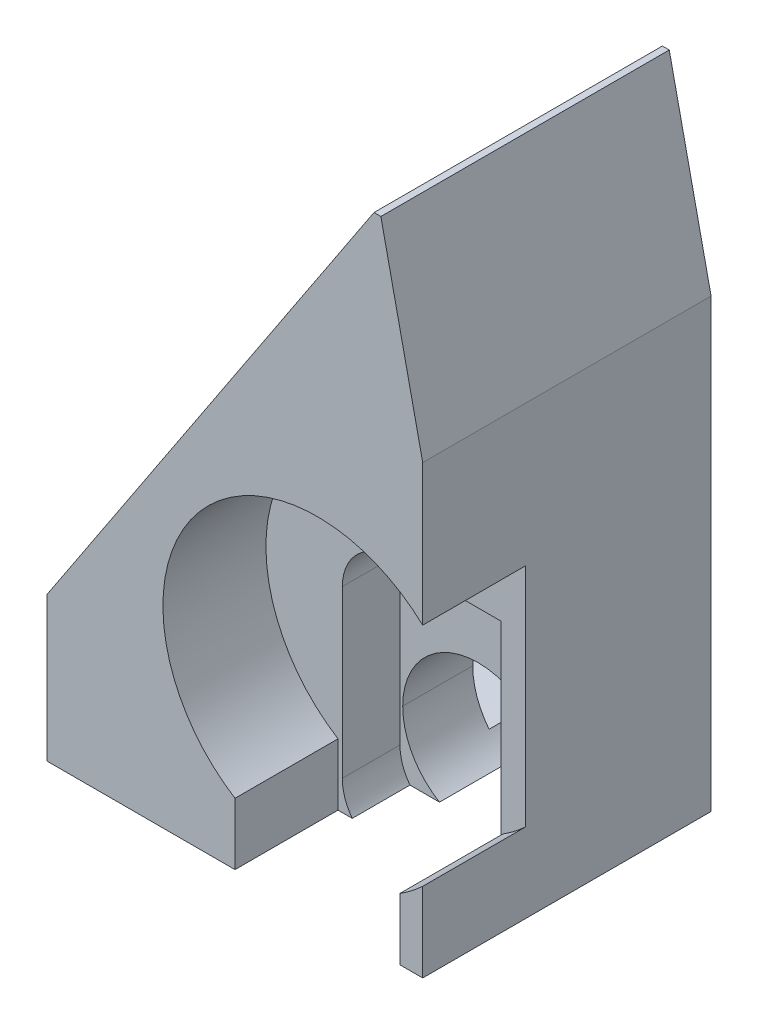
ISO-10303-21;
HEADER;
FILE_DESCRIPTION(('STEP AP214'),'2;1');
FILE_NAME('part.step','',(''),(''),'','','');
FILE_SCHEMA(('AUTOMOTIVE_DESIGN { 1 0 10303 214 1 1 1 1 }'));
ENDSEC;
DATA;
#1=APPLICATION_CONTEXT('core data for automotive mechanical design processes');
#2=APPLICATION_PROTOCOL_DEFINITION('international standard','automotive_design',2000,#1);
#3=PRODUCT_CONTEXT('',#1,'mechanical');
#4=PRODUCT('Part','Part','',(#3));
#5=PRODUCT_RELATED_PRODUCT_CATEGORY('part','',(#4));
#6=PRODUCT_DEFINITION_FORMATION('','',#4);
#7=PRODUCT_DEFINITION_CONTEXT('part definition',#1,'design');
#8=PRODUCT_DEFINITION('design','',#6,#7);
#9=PRODUCT_DEFINITION_SHAPE('','',#8);
#10=(LENGTH_UNIT() NAMED_UNIT(*) SI_UNIT(.MILLI.,.METRE.));
#11=(NAMED_UNIT(*) PLANE_ANGLE_UNIT() SI_UNIT($,.RADIAN.));
#12=(NAMED_UNIT(*) SI_UNIT($,.STERADIAN.) SOLID_ANGLE_UNIT());
#13=UNCERTAINTY_MEASURE_WITH_UNIT(LENGTH_MEASURE(1.E-05),#10,'distance_accuracy_value','');
#14=(GEOMETRIC_REPRESENTATION_CONTEXT(3) GLOBAL_UNCERTAINTY_ASSIGNED_CONTEXT((#13)) GLOBAL_UNIT_ASSIGNED_CONTEXT((#10,
#11,#12)) REPRESENTATION_CONTEXT('',''));
#15=CARTESIAN_POINT('',(0.,0.,0.));
#16=DIRECTION('',(0.,0.,1.));
#17=DIRECTION('',(1.,0.,0.));
#18=AXIS2_PLACEMENT_3D('',#15,#16,#17);
#19=CARTESIAN_POINT('',(-22.6679084803777,-59.7734336982964,0.));
#20=DIRECTION('',(0.,0.,1.));
#21=DIRECTION('',(1.,0.,0.));
#22=AXIS2_PLACEMENT_3D('',#19,#20,#21);
#23=CYLINDRICAL_SURFACE('',#22,18.3);
#24=DIRECTION('',(0.,0.,1.));
#25=VECTOR('',#24,1.);
#26=CARTESIAN_POINT('',(-4.36790848037773,-59.7734336982964,0.));
#27=LINE('',#26,#25);
#28=CARTESIAN_POINT('',(-4.36790848037773,-59.7734336982964,0.));
#29=VERTEX_POINT('',#28);
#30=CARTESIAN_POINT('',(-4.36790848037773,-59.7734336982964,31.));
#31=VERTEX_POINT('',#30);
#32=EDGE_CURVE('E366',#29,#31,#27,.T.);
#33=ORIENTED_EDGE('',*,*,#32,.F.);
#34=CARTESIAN_POINT('',(-22.6679084803777,-59.7734336982964,0.));
#35=DIRECTION('',(0.,0.,1.));
#36=DIRECTION('',(1.,0.,0.));
#37=AXIS2_PLACEMENT_3D('',#34,#35,#36);
#38=CIRCLE('',#37,18.3);
#39=CARTESIAN_POINT('',(-13.2972261280422,-75.4922222092354,0.));
#40=VERTEX_POINT('',#39);
#41=EDGE_CURVE('E440',#40,#29,#38,.T.);
#42=ORIENTED_EDGE('',*,*,#41,.F.);
#43=DIRECTION('',(0.,0.,1.));
#44=VECTOR('',#43,1.);
#45=CARTESIAN_POINT('',(-13.2972261280422,-75.4922222092354,0.));
#46=LINE('',#45,#44);
#47=CARTESIAN_POINT('',(-13.2972261280422,-75.4922222092354,31.));
#48=VERTEX_POINT('',#47);
#49=EDGE_CURVE('E432',#40,#48,#46,.T.);
#50=ORIENTED_EDGE('',*,*,#49,.T.);
#51=CARTESIAN_POINT('',(-22.6679084803777,-59.7734336982964,31.));
#52=DIRECTION('',(0.,0.,1.));
#53=DIRECTION('',(1.,0.,0.));
#54=AXIS2_PLACEMENT_3D('',#51,#52,#53);
#55=CIRCLE('',#54,18.3);
#56=EDGE_CURVE('E407',#48,#31,#55,.T.);
#57=ORIENTED_EDGE('',*,*,#56,.T.);
#58=EDGE_LOOP('',(#33,#42,#50,#57));
#59=FACE_BOUND('',#58,.T.);
#60=ADVANCED_FACE('F17',(#59),#23,.F.);
#61=CARTESIAN_POINT('',(-73.3293826692521,-40.4922222092354,10.));
#62=DIRECTION('',(0.,0.,-1.));
#63=DIRECTION('',(0.,-1.,0.));
#64=AXIS2_PLACEMENT_3D('',#61,#62,#63);
#65=PLANE('',#64);
#66=CARTESIAN_POINT('',(-73.3293826692521,-40.4922222092354,10.));
#67=DIRECTION('',(0.,0.,-1.));
#68=DIRECTION('',(-1.,0.,0.));
#69=AXIS2_PLACEMENT_3D('',#66,#67,#68);
#70=CIRCLE('',#69,1.5);
#71=CARTESIAN_POINT('',(-74.8293826692521,-40.4922222092354,10.));
#72=VERTEX_POINT('',#71);
#73=CARTESIAN_POINT('',(-71.8293826692521,-40.4922222092354,10.));
#74=VERTEX_POINT('',#73);
#75=EDGE_CURVE('E11',#72,#74,#70,.T.);
#76=ORIENTED_EDGE('',*,*,#75,.T.);
#77=CARTESIAN_POINT('',(-73.3293826692521,-40.4922222092354,10.));
#78=DIRECTION('',(0.,0.,-1.));
#79=DIRECTION('',(-1.,0.,0.));
#80=AXIS2_PLACEMENT_3D('',#77,#78,#79);
#81=CIRCLE('',#80,1.5);
#82=EDGE_CURVE('E367',#74,#72,#81,.T.);
#83=ORIENTED_EDGE('',*,*,#82,.T.);
#84=EDGE_LOOP('',(#76,#83));
#85=FACE_BOUND('',#84,.T.);
#86=ADVANCED_FACE('F726',(#85),#65,.T.);
#87=CARTESIAN_POINT('',(-73.3293826692521,-40.4922222092354,10.));
#88=DIRECTION('',(0.,0.,-1.));
#89=DIRECTION('',(-1.,0.,0.));
#90=AXIS2_PLACEMENT_3D('',#87,#88,#89);
#91=CYLINDRICAL_SURFACE('',#90,1.5);
#92=DIRECTION('',(0.,0.,-1.));
#93=VECTOR('',#92,1.);
#94=CARTESIAN_POINT('',(-71.8293826692521,-40.4922222092354,10.));
#95=LINE('',#94,#93);
#96=CARTESIAN_POINT('',(-71.8293826692521,-40.4922222092354,0.));
#97=VERTEX_POINT('',#96);
#98=EDGE_CURVE('E371',#74,#97,#95,.T.);
#99=ORIENTED_EDGE('',*,*,#98,.F.);
#100=ORIENTED_EDGE('',*,*,#75,.F.);
#101=DIRECTION('',(0.,0.,-1.));
#102=VECTOR('',#101,1.);
#103=CARTESIAN_POINT('',(-74.8293826692521,-40.4922222092354,10.));
#104=LINE('',#103,#102);
#105=CARTESIAN_POINT('',(-74.8293826692521,-40.4922222092354,0.));
#106=VERTEX_POINT('',#105);
#107=EDGE_CURVE('E391',#72,#106,#104,.T.);
#108=ORIENTED_EDGE('',*,*,#107,.T.);
#109=CARTESIAN_POINT('',(-73.3293826692521,-40.4922222092354,0.));
#110=DIRECTION('',(0.,0.,-1.));
#111=DIRECTION('',(-1.,0.,0.));
#112=AXIS2_PLACEMENT_3D('',#109,#110,#111);
#113=CIRCLE('',#112,1.5);
#114=EDGE_CURVE('E427',#106,#97,#113,.T.);
#115=ORIENTED_EDGE('',*,*,#114,.T.);
#116=EDGE_LOOP('',(#99,#100,#108,#115));
#117=FACE_BOUND('',#116,.T.);
#118=ADVANCED_FACE('F724',(#117),#91,.F.);
#119=CARTESIAN_POINT('',(-5.11790848037778,-40.4922222092355,10.));
#120=DIRECTION('',(0.,0.,-1.));
#121=DIRECTION('',(0.,-1.,0.));
#122=AXIS2_PLACEMENT_3D('',#119,#120,#121);
#123=PLANE('',#122);
#124=CARTESIAN_POINT('',(-5.11790848037778,-40.4922222092355,10.));
#125=DIRECTION('',(0.,0.,-1.));
#126=DIRECTION('',(-1.,0.,0.));
#127=AXIS2_PLACEMENT_3D('',#124,#125,#126);
#128=CIRCLE('',#127,1.5);
#129=CARTESIAN_POINT('',(-6.61790848037778,-40.4922222092355,10.));
#130=VERTEX_POINT('',#129);
#131=CARTESIAN_POINT('',(-3.61790848037779,-40.4922222092355,10.));
#132=VERTEX_POINT('',#131);
#133=EDGE_CURVE('E20',#130,#132,#128,.T.);
#134=ORIENTED_EDGE('',*,*,#133,.T.);
#135=CARTESIAN_POINT('',(-5.11790848037778,-40.4922222092355,10.));
#136=DIRECTION('',(0.,0.,-1.));
#137=DIRECTION('',(-1.,0.,0.));
#138=AXIS2_PLACEMENT_3D('',#135,#136,#137);
#139=CIRCLE('',#138,1.5);
#140=EDGE_CURVE('E387',#132,#130,#139,.T.);
#141=ORIENTED_EDGE('',*,*,#140,.T.);
#142=EDGE_LOOP('',(#134,#141));
#143=FACE_BOUND('',#142,.T.);
#144=ADVANCED_FACE('F733',(#143),#123,.T.);
#145=CARTESIAN_POINT('',(-5.11790848037778,-40.4922222092355,10.));
#146=DIRECTION('',(0.,0.,-1.));
#147=DIRECTION('',(-1.,0.,0.));
#148=AXIS2_PLACEMENT_3D('',#145,#146,#147);
#149=CYLINDRICAL_SURFACE('',#148,1.5);
#150=DIRECTION('',(0.,0.,-1.));
#151=VECTOR('',#150,1.);
#152=CARTESIAN_POINT('',(-3.61790848037779,-40.4922222092355,10.));
#153=LINE('',#152,#151);
#154=CARTESIAN_POINT('',(-3.61790848037779,-40.4922222092355,0.));
#155=VERTEX_POINT('',#154);
#156=EDGE_CURVE('E386',#132,#155,#153,.T.);
#157=ORIENTED_EDGE('',*,*,#156,.F.);
#158=ORIENTED_EDGE('',*,*,#133,.F.);
#159=DIRECTION('',(0.,0.,-1.));
#160=VECTOR('',#159,1.);
#161=CARTESIAN_POINT('',(-6.61790848037778,-40.4922222092355,10.));
#162=LINE('',#161,#160);
#163=CARTESIAN_POINT('',(-6.61790848037778,-40.4922222092355,0.));
#164=VERTEX_POINT('',#163);
#165=EDGE_CURVE('E385',#130,#164,#162,.T.);
#166=ORIENTED_EDGE('',*,*,#165,.T.);
#167=CARTESIAN_POINT('',(-5.11790848037778,-40.4922222092355,0.));
#168=DIRECTION('',(0.,0.,-1.));
#169=DIRECTION('',(-1.,0.,0.));
#170=AXIS2_PLACEMENT_3D('',#167,#168,#169);
#171=CIRCLE('',#170,1.5);
#172=EDGE_CURVE('E567',#164,#155,#171,.T.);
#173=ORIENTED_EDGE('',*,*,#172,.T.);
#174=EDGE_LOOP('',(#157,#158,#166,#173));
#175=FACE_BOUND('',#174,.T.);
#176=ADVANCED_FACE('F738',(#175),#149,.F.);
#177=CARTESIAN_POINT('',(-54.6679084803778,-71.1467311844123,32.5171080962125));
#178=DIRECTION('',(1.,0.,0.));
#179=DIRECTION('',(0.,1.,0.));
#180=AXIS2_PLACEMENT_3D('',#177,#178,#179);
#181=PLANE('',#180);
#182=DIRECTION('',(0.,1.,0.));
#183=VECTOR('',#182,1.);
#184=CARTESIAN_POINT('',(-54.6679084803778,-71.1467311844123,14.));
#185=LINE('',#184,#183);
#186=CARTESIAN_POINT('',(-54.6679084803778,-75.4922222092354,14.));
#187=VERTEX_POINT('',#186);
#188=CARTESIAN_POINT('',(-54.6679084803778,-71.1467311844123,14.));
#189=VERTEX_POINT('',#188);
#190=EDGE_CURVE('E467',#187,#189,#185,.T.);
#191=ORIENTED_EDGE('',*,*,#190,.T.);
#192=DIRECTION('',(0.,0.,-1.));
#193=VECTOR('',#192,1.);
#194=CARTESIAN_POINT('',(-54.6679084803778,-71.1467311844123,32.5171080962125));
#195=LINE('',#194,#193);
#196=CARTESIAN_POINT('',(-54.6679084803778,-71.1467311844123,0.));
#197=VERTEX_POINT('',#196);
#198=EDGE_CURVE('E548',#189,#197,#195,.T.);
#199=ORIENTED_EDGE('',*,*,#198,.T.);
#200=DIRECTION('',(0.,-1.,0.));
#201=VECTOR('',#200,1.);
#202=CARTESIAN_POINT('',(-54.6679084803778,-71.1467311844123,0.));
#203=LINE('',#202,#201);
#204=CARTESIAN_POINT('',(-54.6679084803778,-75.4922222092354,0.));
#205=VERTEX_POINT('',#204);
#206=EDGE_CURVE('E423',#197,#205,#203,.T.);
#207=ORIENTED_EDGE('',*,*,#206,.T.);
#208=DIRECTION('',(0.,0.,-1.));
#209=VECTOR('',#208,1.);
#210=CARTESIAN_POINT('',(-54.6679084803778,-75.4922222092354,32.5171080962125));
#211=LINE('',#210,#209);
#212=EDGE_CURVE('E609',#187,#205,#211,.T.);
#213=ORIENTED_EDGE('',*,*,#212,.F.);
#214=EDGE_LOOP('',(#191,#199,#207,#213));
#215=FACE_BOUND('',#214,.T.);
#216=ADVANCED_FACE('F740',(#215),#181,.F.);
#217=CARTESIAN_POINT('',(-72.6679084803778,-48.4001362121804,14.));
#218=DIRECTION('',(0.,1.,0.));
#219=DIRECTION('',(1.,0.,0.));
#220=AXIS2_PLACEMENT_3D('',#217,#218,#219);
#221=PLANE('',#220);
#222=DIRECTION('',(1.,0.,0.));
#223=VECTOR('',#222,1.);
#224=CARTESIAN_POINT('',(-72.6679084803778,-48.4001362121804,0.));
#225=LINE('',#224,#223);
#226=CARTESIAN_POINT('',(-72.6679084803778,-48.4001362121804,0.));
#227=VERTEX_POINT('',#226);
#228=CARTESIAN_POINT('',(-37.0045086454206,-48.4001362121804,0.));
#229=VERTEX_POINT('',#228);
#230=EDGE_CURVE('E316',#227,#229,#225,.T.);
#231=ORIENTED_EDGE('',*,*,#230,.T.);
#232=DIRECTION('',(0.,0.,1.));
#233=VECTOR('',#232,1.);
#234=CARTESIAN_POINT('',(-37.0045086454206,-48.4001362121804,0.));
#235=LINE('',#234,#233);
#236=CARTESIAN_POINT('',(-37.0045086454206,-48.4001362121804,14.));
#237=VERTEX_POINT('',#236);
#238=EDGE_CURVE('E313',#229,#237,#235,.T.);
#239=ORIENTED_EDGE('',*,*,#238,.T.);
#240=DIRECTION('',(1.,0.,0.));
#241=VECTOR('',#240,1.);
#242=CARTESIAN_POINT('',(-72.6679084803778,-48.4001362121804,14.));
#243=LINE('',#242,#241);
#244=CARTESIAN_POINT('',(-72.6679084803778,-48.4001362121804,14.));
#245=VERTEX_POINT('',#244);
#246=EDGE_CURVE('E298',#245,#237,#243,.T.);
#247=ORIENTED_EDGE('',*,*,#246,.F.);
#248=DIRECTION('',(0.,0.,-1.));
#249=VECTOR('',#248,1.);
#250=CARTESIAN_POINT('',(-72.6679084803778,-48.4001362121804,14.));
#251=LINE('',#250,#249);
#252=EDGE_CURVE('E410',#245,#227,#251,.T.);
#253=ORIENTED_EDGE('',*,*,#252,.T.);
#254=EDGE_LOOP('',(#231,#239,#247,#253));
#255=FACE_BOUND('',#254,.T.);
#256=ADVANCED_FACE('F314',(#255),#221,.F.);
#257=CARTESIAN_POINT('',(-72.6679084803778,-71.1467311844123,14.));
#258=DIRECTION('',(0.,-1.,0.));
#259=DIRECTION('',(-1.,0.,0.));
#260=AXIS2_PLACEMENT_3D('',#257,#258,#259);
#261=PLANE('',#260);
#262=DIRECTION('',(-1.,0.,0.));
#263=VECTOR('',#262,1.);
#264=CARTESIAN_POINT('',(-72.6679084803778,-71.1467311844123,14.));
#265=LINE('',#264,#263);
#266=CARTESIAN_POINT('',(-37.0045086454206,-71.1467311844124,14.));
#267=VERTEX_POINT('',#266);
#268=EDGE_CURVE('E463',#267,#189,#265,.T.);
#269=ORIENTED_EDGE('',*,*,#268,.F.);
#270=DIRECTION('',(0.,0.,-1.));
#271=VECTOR('',#270,1.);
#272=CARTESIAN_POINT('',(-37.0045086454206,-71.1467311844124,0.));
#273=LINE('',#272,#271);
#274=CARTESIAN_POINT('',(-37.0045086454206,-71.1467311844124,0.));
#275=VERTEX_POINT('',#274);
#276=EDGE_CURVE('E328',#267,#275,#273,.T.);
#277=ORIENTED_EDGE('',*,*,#276,.T.);
#278=DIRECTION('',(-1.,0.,0.));
#279=VECTOR('',#278,1.);
#280=CARTESIAN_POINT('',(-72.6679084803778,-71.1467311844123,0.));
#281=LINE('',#280,#279);
#282=EDGE_CURVE('E398',#275,#197,#281,.T.);
#283=ORIENTED_EDGE('',*,*,#282,.T.);
#284=ORIENTED_EDGE('',*,*,#198,.F.);
#285=EDGE_LOOP('',(#269,#277,#283,#284));
#286=FACE_BOUND('',#285,.T.);
#287=ADVANCED_FACE('F746',(#286),#261,.F.);
#288=CARTESIAN_POINT('',(-72.6679084803778,-71.1467311844123,14.));
#289=DIRECTION('',(-1.,0.,0.));
#290=DIRECTION('',(0.,1.,0.));
#291=AXIS2_PLACEMENT_3D('',#288,#289,#290);
#292=PLANE('',#291);
#293=DIRECTION('',(0.,1.,0.));
#294=VECTOR('',#293,1.);
#295=CARTESIAN_POINT('',(-72.6679084803778,-71.1467311844123,0.));
#296=LINE('',#295,#294);
#297=CARTESIAN_POINT('',(-72.6679084803778,-75.4922222092354,0.));
#298=VERTEX_POINT('',#297);
#299=EDGE_CURVE('E556',#298,#227,#296,.T.);
#300=ORIENTED_EDGE('',*,*,#299,.T.);
#301=ORIENTED_EDGE('',*,*,#252,.F.);
#302=DIRECTION('',(0.,1.,0.));
#303=VECTOR('',#302,1.);
#304=CARTESIAN_POINT('',(-72.6679084803778,-71.1467311844123,14.));
#305=LINE('',#304,#303);
#306=CARTESIAN_POINT('',(-72.6679084803778,-75.4922222092354,14.));
#307=VERTEX_POINT('',#306);
#308=EDGE_CURVE('E307',#307,#245,#305,.T.);
#309=ORIENTED_EDGE('',*,*,#308,.F.);
#310=DIRECTION('',(0.,0.,-1.));
#311=VECTOR('',#310,1.);
#312=CARTESIAN_POINT('',(-72.6679084803778,-75.4922222092354,32.5171080962125));
#313=LINE('',#312,#311);
#314=EDGE_CURVE('E606',#307,#298,#313,.T.);
#315=ORIENTED_EDGE('',*,*,#314,.T.);
#316=EDGE_LOOP('',(#300,#301,#309,#315));
#317=FACE_BOUND('',#316,.T.);
#318=ADVANCED_FACE('F624',(#317),#292,.F.);
#319=CARTESIAN_POINT('',(-29.6176352650218,-27.9686005301704,31.));
#320=DIRECTION('',(0.,0.,1.));
#321=DIRECTION('',(1.,0.,0.));
#322=AXIS2_PLACEMENT_3D('',#319,#320,#321);
#323=PLANE('',#322);
#324=ORIENTED_EDGE('',*,*,#56,.F.);
#325=DIRECTION('',(-1.,0.,0.));
#326=VECTOR('',#325,1.);
#327=CARTESIAN_POINT('',(0.,-75.4922222092354,31.));
#328=LINE('',#327,#326);
#329=CARTESIAN_POINT('',(-3.1179084803778,-75.4922222092354,31.));
#330=VERTEX_POINT('',#329);
#331=EDGE_CURVE('E459',#330,#48,#328,.T.);
#332=ORIENTED_EDGE('',*,*,#331,.F.);
#333=DIRECTION('',(0.,1.,0.));
#334=VECTOR('',#333,1.);
#335=CARTESIAN_POINT('',(-3.1179084803778,-80.2734336982964,31.));
#336=LINE('',#335,#334);
#337=CARTESIAN_POINT('',(-3.11790848037785,-15.9734336982964,31.));
#338=VERTEX_POINT('',#337);
#339=EDGE_CURVE('E482',#330,#338,#336,.T.);
#340=ORIENTED_EDGE('',*,*,#339,.T.);
#341=DIRECTION('',(-1.,0.,0.));
#342=VECTOR('',#341,1.);
#343=CARTESIAN_POINT('',(-3.11790848037785,-15.9734336982964,31.));
#344=LINE('',#343,#342);
#345=CARTESIAN_POINT('',(-29.9581828762438,-15.9734336982964,31.));
#346=VERTEX_POINT('',#345);
#347=EDGE_CURVE('E39',#338,#346,#344,.T.);
#348=ORIENTED_EDGE('',*,*,#347,.T.);
#349=CARTESIAN_POINT('',(-29.6176352650218,-27.9686005301704,31.));
#350=DIRECTION('',(0.,0.,1.));
#351=DIRECTION('',(1.,0.,0.));
#352=AXIS2_PLACEMENT_3D('',#349,#350,#351);
#353=CIRCLE('',#352,12.);
#354=CARTESIAN_POINT('',(-41.6176343534702,-27.9639232192345,31.));
#355=VERTEX_POINT('',#354);
#356=EDGE_CURVE('E47',#346,#355,#353,.T.);
#357=ORIENTED_EDGE('',*,*,#356,.T.);
#358=DIRECTION('',(-0.000389775911353231,-0.999999924037367,0.));
#359=VECTOR('',#358,1.);
#360=CARTESIAN_POINT('',(-41.6176343534703,-27.9639232192345,31.));
#361=LINE('',#360,#359);
#362=CARTESIAN_POINT('',(-41.6333423226978,-68.2639201579405,31.));
#363=VERTEX_POINT('',#362);
#364=EDGE_CURVE('E528',#355,#363,#361,.T.);
#365=ORIENTED_EDGE('',*,*,#364,.T.);
#366=CARTESIAN_POINT('',(-29.6321344205403,-68.2698072251905,31.));
#367=DIRECTION('',(0.,0.,1.));
#368=DIRECTION('',(1.,0.,0.));
#369=AXIS2_PLACEMENT_3D('',#366,#367,#368);
#370=CIRCLE('',#369,12.0012093460772);
#371=CARTESIAN_POINT('',(-39.2167965203023,-75.4922222092354,31.));
#372=VERTEX_POINT('',#371);
#373=EDGE_CURVE('E485',#363,#372,#370,.T.);
#374=ORIENTED_EDGE('',*,*,#373,.T.);
#375=DIRECTION('',(-1.,0.,0.));
#376=VECTOR('',#375,1.);
#377=CARTESIAN_POINT('',(0.,-75.4922222092354,31.));
#378=LINE('',#377,#376);
#379=CARTESIAN_POINT('',(-32.0385908327133,-75.4922222092354,31.));
#380=VERTEX_POINT('',#379);
#381=EDGE_CURVE('E595',#380,#372,#378,.T.);
#382=ORIENTED_EDGE('',*,*,#381,.F.);
#383=CARTESIAN_POINT('',(-22.6679084803777,-59.7734336982964,31.));
#384=DIRECTION('',(0.,0.,1.));
#385=DIRECTION('',(1.,0.,0.));
#386=AXIS2_PLACEMENT_3D('',#383,#384,#385);
#387=CIRCLE('',#386,18.3);
#388=CARTESIAN_POINT('',(-40.9679084803778,-59.7734336982964,31.));
#389=VERTEX_POINT('',#388);
#390=EDGE_CURVE('E646',#389,#380,#387,.T.);
#391=ORIENTED_EDGE('',*,*,#390,.F.);
#392=CARTESIAN_POINT('',(-22.6679084803777,-59.7734336982964,31.));
#393=DIRECTION('',(0.,0.,1.));
#394=DIRECTION('',(1.,0.,0.));
#395=AXIS2_PLACEMENT_3D('',#392,#393,#394);
#396=CIRCLE('',#395,18.3);
#397=EDGE_CURVE('E372',#31,#389,#396,.T.);
#398=ORIENTED_EDGE('',*,*,#397,.F.);
#399=EDGE_LOOP('',(#324,#332,#340,#348,#357,#365,#374,#382,#391,#398));
#400=FACE_BOUND('',#399,.T.);
#401=ADVANCED_FACE('F668',(#400),#323,.T.);
#402=CARTESIAN_POINT('',(-3.11790848037785,-15.9734336982964,31.));
#403=DIRECTION('',(0.,1.,0.));
#404=DIRECTION('',(1.,0.,0.));
#405=AXIS2_PLACEMENT_3D('',#402,#403,#404);
#406=PLANE('',#405);
#407=DIRECTION('',(-1.,0.,0.));
#408=VECTOR('',#407,1.);
#409=CARTESIAN_POINT('',(-3.11790848037785,-15.9734336982964,45.));
#410=LINE('',#409,#408);
#411=CARTESIAN_POINT('',(-3.11790848037785,-15.9734336982964,45.));
#412=VERTEX_POINT('',#411);
#413=CARTESIAN_POINT('',(-29.9581828762438,-15.9734336982964,45.));
#414=VERTEX_POINT('',#413);
#415=EDGE_CURVE('E576',#412,#414,#410,.T.);
#416=ORIENTED_EDGE('',*,*,#415,.T.);
#417=DIRECTION('',(0.,0.,1.));
#418=VECTOR('',#417,1.);
#419=CARTESIAN_POINT('',(-29.9581828762438,-15.9734336982964,31.));
#420=LINE('',#419,#418);
#421=EDGE_CURVE('E435',#346,#414,#420,.T.);
#422=ORIENTED_EDGE('',*,*,#421,.F.);
#423=ORIENTED_EDGE('',*,*,#347,.F.);
#424=DIRECTION('',(0.,0.,1.));
#425=VECTOR('',#424,1.);
#426=CARTESIAN_POINT('',(-3.11790848037785,-15.9734336982964,31.));
#427=LINE('',#426,#425);
#428=EDGE_CURVE('E486',#338,#412,#427,.T.);
#429=ORIENTED_EDGE('',*,*,#428,.T.);
#430=EDGE_LOOP('',(#416,#422,#423,#429));
#431=FACE_BOUND('',#430,.T.);
#432=ADVANCED_FACE('F752',(#431),#406,.F.);
#433=CARTESIAN_POINT('',(-29.6176352650218,-27.9686005301704,31.));
#434=DIRECTION('',(0.,0.,1.));
#435=DIRECTION('',(1.,0.,0.));
#436=AXIS2_PLACEMENT_3D('',#433,#434,#435);
#437=CYLINDRICAL_SURFACE('',#436,12.);
#438=CARTESIAN_POINT('',(-29.6176352650218,-27.9686005301704,45.));
#439=DIRECTION('',(0.,0.,1.));
#440=DIRECTION('',(1.,0.,0.));
#441=AXIS2_PLACEMENT_3D('',#438,#439,#440);
#442=CIRCLE('',#441,12.);
#443=CARTESIAN_POINT('',(-41.6176343534702,-27.9639232192345,45.));
#444=VERTEX_POINT('',#443);
#445=EDGE_CURVE('E415',#414,#444,#442,.T.);
#446=ORIENTED_EDGE('',*,*,#445,.T.);
#447=DIRECTION('',(0.,0.,1.));
#448=VECTOR('',#447,1.);
#449=CARTESIAN_POINT('',(-41.6176343534702,-27.9639232192345,31.));
#450=LINE('',#449,#448);
#451=EDGE_CURVE('E436',#355,#444,#450,.T.);
#452=ORIENTED_EDGE('',*,*,#451,.F.);
#453=ORIENTED_EDGE('',*,*,#356,.F.);
#454=ORIENTED_EDGE('',*,*,#421,.T.);
#455=EDGE_LOOP('',(#446,#452,#453,#454));
#456=FACE_BOUND('',#455,.T.);
#457=ADVANCED_FACE('F755',(#456),#437,.F.);
#458=CARTESIAN_POINT('',(-41.6176343534703,-27.9639232192345,31.));
#459=DIRECTION('',(-0.999999924037366,0.000389775911353231,0.));
#460=DIRECTION('',(0.,0.,1.));
#461=AXIS2_PLACEMENT_3D('',#458,#459,#460);
#462=PLANE('',#461);
#463=DIRECTION('',(-0.000389775911353231,-0.999999924037367,0.));
#464=VECTOR('',#463,1.);
#465=CARTESIAN_POINT('',(-41.6176343534703,-27.9639232192345,45.));
#466=LINE('',#465,#464);
#467=CARTESIAN_POINT('',(-41.6333423226978,-68.2639201579405,45.));
#468=VERTEX_POINT('',#467);
#469=EDGE_CURVE('E411',#444,#468,#466,.T.);
#470=ORIENTED_EDGE('',*,*,#469,.T.);
#471=DIRECTION('',(0.,0.,1.));
#472=VECTOR('',#471,1.);
#473=CARTESIAN_POINT('',(-41.6333423226978,-68.2639201579405,31.));
#474=LINE('',#473,#472);
#475=EDGE_CURVE('E531',#363,#468,#474,.T.);
#476=ORIENTED_EDGE('',*,*,#475,.F.);
#477=ORIENTED_EDGE('',*,*,#364,.F.);
#478=ORIENTED_EDGE('',*,*,#451,.T.);
#479=EDGE_LOOP('',(#470,#476,#477,#478));
#480=FACE_BOUND('',#479,.T.);
#481=ADVANCED_FACE('F759',(#480),#462,.F.);
#482=CARTESIAN_POINT('',(-29.6321344205403,-68.2698072251905,31.));
#483=DIRECTION('',(0.,0.,1.));
#484=DIRECTION('',(1.,0.,0.));
#485=AXIS2_PLACEMENT_3D('',#482,#483,#484);
#486=CYLINDRICAL_SURFACE('',#485,12.0012093460772);
#487=DIRECTION('',(0.,0.,-1.));
#488=VECTOR('',#487,1.);
#489=CARTESIAN_POINT('',(-39.2167965203023,-75.4922222092354,31.));
#490=LINE('',#489,#488);
#491=CARTESIAN_POINT('',(-39.2167965203023,-75.4922222092354,45.));
#492=VERTEX_POINT('',#491);
#493=EDGE_CURVE('E602',#492,#372,#490,.T.);
#494=ORIENTED_EDGE('',*,*,#493,.T.);
#495=ORIENTED_EDGE('',*,*,#373,.F.);
#496=ORIENTED_EDGE('',*,*,#475,.T.);
#497=CARTESIAN_POINT('',(-29.6321344205403,-68.2698072251905,45.));
#498=DIRECTION('',(0.,0.,1.));
#499=DIRECTION('',(1.,0.,0.));
#500=AXIS2_PLACEMENT_3D('',#497,#498,#499);
#501=CIRCLE('',#500,12.0012093460772);
#502=EDGE_CURVE('E416',#468,#492,#501,.T.);
#503=ORIENTED_EDGE('',*,*,#502,.T.);
#504=EDGE_LOOP('',(#494,#495,#496,#503));
#505=FACE_BOUND('',#504,.T.);
#506=ADVANCED_FACE('F761',(#505),#486,.F.);
#507=CARTESIAN_POINT('',(-3.1179084803778,-80.2734336982964,31.));
#508=DIRECTION('',(1.,0.,0.));
#509=DIRECTION('',(0.,1.,0.));
#510=AXIS2_PLACEMENT_3D('',#507,#508,#509);
#511=PLANE('',#510);
#512=DIRECTION('',(0.,0.,1.));
#513=VECTOR('',#512,1.);
#514=CARTESIAN_POINT('',(-3.1179084803778,-75.4922222092354,0.));
#515=LINE('',#514,#513);
#516=CARTESIAN_POINT('',(-3.1179084803778,-75.4922222092354,45.));
#517=VERTEX_POINT('',#516);
#518=EDGE_CURVE('E455',#330,#517,#515,.T.);
#519=ORIENTED_EDGE('',*,*,#518,.T.);
#520=DIRECTION('',(0.,1.,0.));
#521=VECTOR('',#520,1.);
#522=CARTESIAN_POINT('',(-3.1179084803778,-80.2734336982964,45.));
#523=LINE('',#522,#521);
#524=EDGE_CURVE('E363',#517,#412,#523,.T.);
#525=ORIENTED_EDGE('',*,*,#524,.T.);
#526=ORIENTED_EDGE('',*,*,#428,.F.);
#527=ORIENTED_EDGE('',*,*,#339,.F.);
#528=EDGE_LOOP('',(#519,#525,#526,#527));
#529=FACE_BOUND('',#528,.T.);
#530=ADVANCED_FACE('F666',(#529),#511,.F.);
#531=CARTESIAN_POINT('',(0.,-75.4922222092354,0.));
#532=DIRECTION('',(0.,-1.,0.));
#533=DIRECTION('',(0.,0.,-1.));
#534=AXIS2_PLACEMENT_3D('',#531,#532,#533);
#535=PLANE('',#534);
#536=DIRECTION('',(0.,0.,-1.));
#537=VECTOR('',#536,1.);
#538=CARTESIAN_POINT('',(-32.0385908327133,-75.4922222092354,0.));
#539=LINE('',#538,#537);
#540=CARTESIAN_POINT('',(-32.0385908327133,-75.4922222092354,0.));
#541=VERTEX_POINT('',#540);
#542=EDGE_CURVE('E642',#380,#541,#539,.T.);
#543=ORIENTED_EDGE('',*,*,#542,.F.);
#544=ORIENTED_EDGE('',*,*,#381,.T.);
#545=ORIENTED_EDGE('',*,*,#493,.F.);
#546=DIRECTION('',(-1.,0.,0.));
#547=VECTOR('',#546,1.);
#548=CARTESIAN_POINT('',(-2.66369753872055,-75.4922222092354,45.));
#549=LINE('',#548,#547);
#550=CARTESIAN_POINT('',(-42.6721194220356,-75.4922222092354,45.));
#551=VERTEX_POINT('',#550);
#552=EDGE_CURVE('E586',#492,#551,#549,.T.);
#553=ORIENTED_EDGE('',*,*,#552,.T.);
#554=DIRECTION('',(0.,0.,1.));
#555=VECTOR('',#554,1.);
#556=CARTESIAN_POINT('',(-42.6721194220356,-75.4922222092354,45.));
#557=LINE('',#556,#555);
#558=CARTESIAN_POINT('',(-42.6721194220356,-75.4922222092354,70.));
#559=VERTEX_POINT('',#558);
#560=EDGE_CURVE('E580',#551,#559,#557,.T.);
#561=ORIENTED_EDGE('',*,*,#560,.T.);
#562=DIRECTION('',(-1.,0.,0.));
#563=VECTOR('',#562,1.);
#564=CARTESIAN_POINT('',(-42.6721194220356,-75.4922222092354,70.));
#565=LINE('',#564,#563);
#566=CARTESIAN_POINT('',(-88.3293826692521,-75.4922222092354,70.));
#567=VERTEX_POINT('',#566);
#568=EDGE_CURVE('E356',#559,#567,#565,.T.);
#569=ORIENTED_EDGE('',*,*,#568,.T.);
#570=DIRECTION('',(0.,0.,-1.));
#571=VECTOR('',#570,1.);
#572=CARTESIAN_POINT('',(-88.3293826692521,-75.4922222092354,70.));
#573=LINE('',#572,#571);
#574=CARTESIAN_POINT('',(-88.3293826692521,-75.4922222092354,0.));
#575=VERTEX_POINT('',#574);
#576=EDGE_CURVE('E570',#567,#575,#573,.T.);
#577=ORIENTED_EDGE('',*,*,#576,.T.);
#578=DIRECTION('',(1.,0.,0.));
#579=VECTOR('',#578,1.);
#580=CARTESIAN_POINT('',(-88.3293826692521,-75.4922222092354,0.));
#581=LINE('',#580,#579);
#582=EDGE_CURVE('E428',#575,#298,#581,.T.);
#583=ORIENTED_EDGE('',*,*,#582,.T.);
#584=ORIENTED_EDGE('',*,*,#314,.F.);
#585=DIRECTION('',(1.,0.,0.));
#586=VECTOR('',#585,1.);
#587=CARTESIAN_POINT('',(-72.6679084803778,-75.4922222092354,14.));
#588=LINE('',#587,#586);
#589=EDGE_CURVE('E470',#307,#187,#588,.T.);
#590=ORIENTED_EDGE('',*,*,#589,.T.);
#591=ORIENTED_EDGE('',*,*,#212,.T.);
#592=DIRECTION('',(1.,0.,0.));
#593=VECTOR('',#592,1.);
#594=CARTESIAN_POINT('',(-88.3293826692521,-75.4922222092354,0.));
#595=LINE('',#594,#593);
#596=EDGE_CURVE('E405',#205,#541,#595,.T.);
#597=ORIENTED_EDGE('',*,*,#596,.T.);
#598=EDGE_LOOP('',(#543,#544,#545,#553,#561,#569,#577,#583,#584,#590,#591,#597));
#599=FACE_BOUND('',#598,.T.);
#600=ADVANCED_FACE('F769',(#599),#535,.T.);
#601=CARTESIAN_POINT('',(-42.6721194220356,-75.4922222092354,45.));
#602=DIRECTION('',(-1.,0.,0.));
#603=DIRECTION('',(0.,1.,0.));
#604=AXIS2_PLACEMENT_3D('',#601,#602,#603);
#605=PLANE('',#604);
#606=DIRECTION('',(0.,0.,-1.));
#607=VECTOR('',#606,1.);
#608=CARTESIAN_POINT('',(-42.6721194220356,-60.4922222092354,45.));
#609=LINE('',#608,#607);
#610=CARTESIAN_POINT('',(-42.6721194220356,-60.4922222092354,70.));
#611=VERTEX_POINT('',#610);
#612=CARTESIAN_POINT('',(-42.6721194220356,-60.4922222092354,45.));
#613=VERTEX_POINT('',#612);
#614=EDGE_CURVE('E523',#611,#613,#609,.T.);
#615=ORIENTED_EDGE('',*,*,#614,.F.);
#616=DIRECTION('',(0.,1.,0.));
#617=VECTOR('',#616,1.);
#618=CARTESIAN_POINT('',(-42.6721194220356,-75.4922222092354,70.));
#619=LINE('',#618,#617);
#620=EDGE_CURVE('E505',#559,#611,#619,.T.);
#621=ORIENTED_EDGE('',*,*,#620,.F.);
#622=ORIENTED_EDGE('',*,*,#560,.F.);
#623=DIRECTION('',(0.,1.,0.));
#624=VECTOR('',#623,1.);
#625=CARTESIAN_POINT('',(-42.6721194220356,-75.4922222092354,45.));
#626=LINE('',#625,#624);
#627=EDGE_CURVE('E362',#551,#613,#626,.T.);
#628=ORIENTED_EDGE('',*,*,#627,.T.);
#629=EDGE_LOOP('',(#615,#621,#622,#628));
#630=FACE_BOUND('',#629,.T.);
#631=ADVANCED_FACE('F775',(#630),#605,.F.);
#632=CARTESIAN_POINT('',(-2.66369753872055,-75.4922222092354,70.));
#633=DIRECTION('',(1.,0.,0.));
#634=DIRECTION('',(0.,1.,0.));
#635=AXIS2_PLACEMENT_3D('',#632,#633,#634);
#636=PLANE('',#635);
#637=DIRECTION('',(0.,0.,1.));
#638=VECTOR('',#637,1.);
#639=CARTESIAN_POINT('',(-2.66369753872056,-60.4922222092354,45.));
#640=LINE('',#639,#638);
#641=CARTESIAN_POINT('',(-2.66369753872056,-60.4922222092354,45.));
#642=VERTEX_POINT('',#641);
#643=CARTESIAN_POINT('',(-2.66369753872056,-60.4922222092354,70.));
#644=VERTEX_POINT('',#643);
#645=EDGE_CURVE('E520',#642,#644,#640,.T.);
#646=ORIENTED_EDGE('',*,*,#645,.F.);
#647=DIRECTION('',(0.,1.,0.));
#648=VECTOR('',#647,1.);
#649=CARTESIAN_POINT('',(-2.66369753872055,-75.4922222092354,45.));
#650=LINE('',#649,#648);
#651=CARTESIAN_POINT('',(-2.66369753872055,-75.4922222092354,45.));
#652=VERTEX_POINT('',#651);
#653=EDGE_CURVE('E359',#652,#642,#650,.T.);
#654=ORIENTED_EDGE('',*,*,#653,.F.);
#655=DIRECTION('',(0.,0.,-1.));
#656=VECTOR('',#655,1.);
#657=CARTESIAN_POINT('',(-2.66369753872055,-75.4922222092354,70.));
#658=LINE('',#657,#656);
#659=CARTESIAN_POINT('',(-2.66369753872055,-75.4922222092354,70.));
#660=VERTEX_POINT('',#659);
#661=EDGE_CURVE('E420',#660,#652,#658,.T.);
#662=ORIENTED_EDGE('',*,*,#661,.F.);
#663=DIRECTION('',(0.,1.,0.));
#664=VECTOR('',#663,1.);
#665=CARTESIAN_POINT('',(-2.66369753872055,-75.4922222092354,70.));
#666=LINE('',#665,#664);
#667=EDGE_CURVE('E376',#660,#644,#666,.T.);
#668=ORIENTED_EDGE('',*,*,#667,.T.);
#669=EDGE_LOOP('',(#646,#654,#662,#668));
#670=FACE_BOUND('',#669,.T.);
#671=ADVANCED_FACE('F679',(#670),#636,.F.);
#672=CARTESIAN_POINT('',(-22.6679084803781,-28.7734336982965,45.));
#673=DIRECTION('',(0.,0.,1.));
#674=DIRECTION('',(1.,0.,0.));
#675=AXIS2_PLACEMENT_3D('',#672,#673,#674);
#676=PLANE('',#675);
#677=ORIENTED_EDGE('',*,*,#524,.F.);
#678=DIRECTION('',(-1.,0.,0.));
#679=VECTOR('',#678,1.);
#680=CARTESIAN_POINT('',(-2.66369753872055,-75.4922222092354,45.));
#681=LINE('',#680,#679);
#682=EDGE_CURVE('E454',#652,#517,#681,.T.);
#683=ORIENTED_EDGE('',*,*,#682,.F.);
#684=ORIENTED_EDGE('',*,*,#653,.T.);
#685=CARTESIAN_POINT('',(-22.6679084803781,-28.7734336982965,45.));
#686=DIRECTION('',(0.,0.,1.));
#687=DIRECTION('',(1.,0.,0.));
#688=AXIS2_PLACEMENT_3D('',#685,#686,#687);
#689=CIRCLE('',#688,37.5);
#690=CARTESIAN_POINT('',(2.88209151962222,-56.2224318585206,45.));
#691=VERTEX_POINT('',#690);
#692=EDGE_CURVE('E524',#642,#691,#689,.T.);
#693=ORIENTED_EDGE('',*,*,#692,.T.);
#694=DIRECTION('',(0.,1.,0.));
#695=VECTOR('',#694,1.);
#696=CARTESIAN_POINT('',(2.88209151962222,-40.4922222092354,45.));
#697=LINE('',#696,#695);
#698=CARTESIAN_POINT('',(2.88209151962222,-1.3244355380724,45.));
#699=VERTEX_POINT('',#698);
#700=EDGE_CURVE('E474',#691,#699,#697,.T.);
#701=ORIENTED_EDGE('',*,*,#700,.T.);
#702=CARTESIAN_POINT('',(-22.6679084803781,-28.7734336982965,45.));
#703=DIRECTION('',(0.,0.,1.));
#704=DIRECTION('',(1.,0.,0.));
#705=AXIS2_PLACEMENT_3D('',#702,#703,#704);
#706=CIRCLE('',#705,37.5);
#707=EDGE_CURVE('E498',#699,#613,#706,.T.);
#708=ORIENTED_EDGE('',*,*,#707,.T.);
#709=ORIENTED_EDGE('',*,*,#627,.F.);
#710=ORIENTED_EDGE('',*,*,#552,.F.);
#711=ORIENTED_EDGE('',*,*,#502,.F.);
#712=ORIENTED_EDGE('',*,*,#469,.F.);
#713=ORIENTED_EDGE('',*,*,#445,.F.);
#714=ORIENTED_EDGE('',*,*,#415,.F.);
#715=EDGE_LOOP('',(#677,#683,#684,#693,#701,#708,#709,#710,#711,#712,#713,#714));
#716=FACE_BOUND('',#715,.T.);
#717=ADVANCED_FACE('F660',(#716),#676,.T.);
#718=CARTESIAN_POINT('',(-22.6679084803781,-28.7734336982965,45.));
#719=DIRECTION('',(0.,0.,1.));
#720=DIRECTION('',(1.,0.,0.));
#721=AXIS2_PLACEMENT_3D('',#718,#719,#720);
#722=CYLINDRICAL_SURFACE('',#721,37.5);
#723=CARTESIAN_POINT('',(-22.6679084803781,-28.7734336982965,70.));
#724=DIRECTION('',(0.,0.,1.));
#725=DIRECTION('',(1.,0.,0.));
#726=AXIS2_PLACEMENT_3D('',#723,#724,#725);
#727=CIRCLE('',#726,37.5);
#728=CARTESIAN_POINT('',(2.88209151962222,-1.3244355380724,70.));
#729=VERTEX_POINT('',#728);
#730=EDGE_CURVE('E310',#729,#611,#727,.T.);
#731=ORIENTED_EDGE('',*,*,#730,.T.);
#732=ORIENTED_EDGE('',*,*,#614,.T.);
#733=ORIENTED_EDGE('',*,*,#707,.F.);
#734=DIRECTION('',(0.,0.,-1.));
#735=VECTOR('',#734,1.);
#736=CARTESIAN_POINT('',(2.88209151962222,-1.3244355380724,45.));
#737=LINE('',#736,#735);
#738=EDGE_CURVE('E447',#729,#699,#737,.T.);
#739=ORIENTED_EDGE('',*,*,#738,.F.);
#740=EDGE_LOOP('',(#731,#732,#733,#739));
#741=FACE_BOUND('',#740,.T.);
#742=ADVANCED_FACE('F782',(#741),#722,.F.);
#743=CARTESIAN_POINT('',(-22.6679084803781,-28.7734336982965,45.));
#744=DIRECTION('',(0.,0.,1.));
#745=DIRECTION('',(1.,0.,0.));
#746=AXIS2_PLACEMENT_3D('',#743,#744,#745);
#747=CYLINDRICAL_SURFACE('',#746,37.5);
#748=ORIENTED_EDGE('',*,*,#692,.F.);
#749=ORIENTED_EDGE('',*,*,#645,.T.);
#750=CARTESIAN_POINT('',(-22.6679084803781,-28.7734336982965,70.));
#751=DIRECTION('',(0.,0.,1.));
#752=DIRECTION('',(1.,0.,0.));
#753=AXIS2_PLACEMENT_3D('',#750,#751,#752);
#754=CIRCLE('',#753,37.5);
#755=CARTESIAN_POINT('',(2.88209151962222,-56.2224318585206,70.));
#756=VERTEX_POINT('',#755);
#757=EDGE_CURVE('E373',#644,#756,#754,.T.);
#758=ORIENTED_EDGE('',*,*,#757,.T.);
#759=DIRECTION('',(0.,0.,1.));
#760=VECTOR('',#759,1.);
#761=CARTESIAN_POINT('',(2.88209151962222,-56.2224318585206,45.));
#762=LINE('',#761,#760);
#763=EDGE_CURVE('E346',#691,#756,#762,.T.);
#764=ORIENTED_EDGE('',*,*,#763,.F.);
#765=EDGE_LOOP('',(#748,#749,#758,#764));
#766=FACE_BOUND('',#765,.T.);
#767=ADVANCED_FACE('F682',(#766),#747,.F.);
#768=CARTESIAN_POINT('',(-88.3293826692521,-60.4922222092354,70.));
#769=DIRECTION('',(1.,0.,0.));
#770=DIRECTION('',(0.,1.,0.));
#771=AXIS2_PLACEMENT_3D('',#768,#769,#770);
#772=PLANE('',#771);
#773=DIRECTION('',(0.,0.,-1.));
#774=VECTOR('',#773,1.);
#775=CARTESIAN_POINT('',(-88.3293826692521,-40.4922222092354,70.));
#776=LINE('',#775,#774);
#777=CARTESIAN_POINT('',(-88.3293826692521,-40.4922222092354,70.));
#778=VERTEX_POINT('',#777);
#779=CARTESIAN_POINT('',(-88.3293826692521,-40.4922222092354,0.));
#780=VERTEX_POINT('',#779);
#781=EDGE_CURVE('E513',#778,#780,#776,.T.);
#782=ORIENTED_EDGE('',*,*,#781,.T.);
#783=DIRECTION('',(0.,1.,0.));
#784=VECTOR('',#783,1.);
#785=CARTESIAN_POINT('',(-88.3293826692521,-60.4922222092354,0.));
#786=LINE('',#785,#784);
#787=EDGE_CURVE('E424',#575,#780,#786,.T.);
#788=ORIENTED_EDGE('',*,*,#787,.F.);
#789=ORIENTED_EDGE('',*,*,#576,.F.);
#790=DIRECTION('',(0.,1.,0.));
#791=VECTOR('',#790,1.);
#792=CARTESIAN_POINT('',(-88.3293826692521,-60.4922222092354,70.));
#793=LINE('',#792,#791);
#794=EDGE_CURVE('E353',#567,#778,#793,.T.);
#795=ORIENTED_EDGE('',*,*,#794,.T.);
#796=EDGE_LOOP('',(#782,#788,#789,#795));
#797=FACE_BOUND('',#796,.T.);
#798=ADVANCED_FACE('F788',(#797),#772,.F.);
#799=CARTESIAN_POINT('',(0.,0.,0.));
#800=DIRECTION('',(0.,0.,1.));
#801=DIRECTION('',(1.,0.,0.));
#802=AXIS2_PLACEMENT_3D('',#799,#800,#801);
#803=PLANE('',#802);
#804=ORIENTED_EDGE('',*,*,#172,.F.);
#805=CARTESIAN_POINT('',(-5.11790848037778,-40.4922222092355,0.));
#806=DIRECTION('',(0.,0.,-1.));
#807=DIRECTION('',(-1.,0.,0.));
#808=AXIS2_PLACEMENT_3D('',#805,#806,#807);
#809=CIRCLE('',#808,1.5);
#810=EDGE_CURVE('E381',#155,#164,#809,.T.);
#811=ORIENTED_EDGE('',*,*,#810,.F.);
#812=EDGE_LOOP('',(#804,#811));
#813=FACE_BOUND('',#812,.T.);
#814=ORIENTED_EDGE('',*,*,#114,.F.);
#815=CARTESIAN_POINT('',(-73.3293826692521,-40.4922222092354,0.));
#816=DIRECTION('',(0.,0.,-1.));
#817=DIRECTION('',(-1.,0.,0.));
#818=AXIS2_PLACEMENT_3D('',#815,#816,#817);
#819=CIRCLE('',#818,1.5);
#820=EDGE_CURVE('E339',#97,#106,#819,.T.);
#821=ORIENTED_EDGE('',*,*,#820,.F.);
#822=EDGE_LOOP('',(#814,#821));
#823=FACE_BOUND('',#822,.T.);
#824=DIRECTION('',(1.,0.,0.));
#825=VECTOR('',#824,1.);
#826=CARTESIAN_POINT('',(-88.3293826692521,-75.4922222092354,0.));
#827=LINE('',#826,#825);
#828=CARTESIAN_POINT('',(2.88209151962222,-75.4922222092354,0.));
#829=VERTEX_POINT('',#828);
#830=EDGE_CURVE('E351',#40,#829,#827,.T.);
#831=ORIENTED_EDGE('',*,*,#830,.F.);
#832=ORIENTED_EDGE('',*,*,#41,.T.);
#833=CARTESIAN_POINT('',(-22.6679084803777,-59.7734336982964,0.));
#834=DIRECTION('',(0.,0.,1.));
#835=DIRECTION('',(1.,0.,0.));
#836=AXIS2_PLACEMENT_3D('',#833,#834,#835);
#837=CIRCLE('',#836,18.3);
#838=EDGE_CURVE('E321',#29,#229,#837,.T.);
#839=ORIENTED_EDGE('',*,*,#838,.T.);
#840=ORIENTED_EDGE('',*,*,#230,.F.);
#841=ORIENTED_EDGE('',*,*,#299,.F.);
#842=ORIENTED_EDGE('',*,*,#582,.F.);
#843=ORIENTED_EDGE('',*,*,#787,.T.);
#844=DIRECTION('',(-0.551769207168103,-0.833996847728505,0.));
#845=VECTOR('',#844,1.);
#846=CARTESIAN_POINT('',(-8.93782976289527,79.5077777907646,0.));
#847=LINE('',#846,#845);
#848=CARTESIAN_POINT('',(-8.93782976289527,79.5077777907646,0.));
#849=VERTEX_POINT('',#848);
#850=EDGE_CURVE('E509',#849,#780,#847,.T.);
#851=ORIENTED_EDGE('',*,*,#850,.F.);
#852=DIRECTION('',(-1.,0.,0.));
#853=VECTOR('',#852,1.);
#854=CARTESIAN_POINT('',(-7.27157334356914,79.5077777907646,0.));
#855=LINE('',#854,#853);
#856=CARTESIAN_POINT('',(-7.27157334356914,79.5077777907646,0.));
#857=VERTEX_POINT('',#856);
#858=EDGE_CURVE('E377',#857,#849,#855,.T.);
#859=ORIENTED_EDGE('',*,*,#858,.F.);
#860=DIRECTION('',(-0.212686858193502,0.977120412411785,0.));
#861=VECTOR('',#860,1.);
#862=CARTESIAN_POINT('',(2.88209151962222,32.8600757047893,0.));
#863=LINE('',#862,#861);
#864=CARTESIAN_POINT('',(2.88209151962222,32.8600757047893,0.));
#865=VERTEX_POINT('',#864);
#866=EDGE_CURVE('E538',#865,#857,#863,.T.);
#867=ORIENTED_EDGE('',*,*,#866,.F.);
#868=DIRECTION('',(0.,1.,0.));
#869=VECTOR('',#868,1.);
#870=CARTESIAN_POINT('',(2.88209151962222,-40.4922222092354,0.));
#871=LINE('',#870,#869);
#872=EDGE_CURVE('E345',#829,#865,#871,.T.);
#873=ORIENTED_EDGE('',*,*,#872,.F.);
#874=EDGE_LOOP('',(#831,#832,#839,#840,#841,#842,#843,#851,#859,#867,#873));
#875=FACE_BOUND('',#874,.T.);
#876=ADVANCED_FACE('F628',(#813,#823,#875),#803,.F.);
#877=CARTESIAN_POINT('',(0.,0.,70.));
#878=DIRECTION('',(0.,0.,1.));
#879=DIRECTION('',(1.,0.,0.));
#880=AXIS2_PLACEMENT_3D('',#877,#878,#879);
#881=PLANE('',#880);
#882=ORIENTED_EDGE('',*,*,#757,.F.);
#883=ORIENTED_EDGE('',*,*,#667,.F.);
#884=DIRECTION('',(-1.,0.,0.));
#885=VECTOR('',#884,1.);
#886=CARTESIAN_POINT('',(2.88209151962222,-75.4922222092354,70.));
#887=LINE('',#886,#885);
#888=CARTESIAN_POINT('',(2.88209151962222,-75.4922222092354,70.));
#889=VERTEX_POINT('',#888);
#890=EDGE_CURVE('E350',#889,#660,#887,.T.);
#891=ORIENTED_EDGE('',*,*,#890,.F.);
#892=DIRECTION('',(0.,1.,0.));
#893=VECTOR('',#892,1.);
#894=CARTESIAN_POINT('',(2.88209151962222,-40.4922222092354,70.));
#895=LINE('',#894,#893);
#896=EDGE_CURVE('E341',#889,#756,#895,.T.);
#897=ORIENTED_EDGE('',*,*,#896,.T.);
#898=EDGE_LOOP('',(#882,#883,#891,#897));
#899=FACE_BOUND('',#898,.T.);
#900=ADVANCED_FACE('F677',(#899),#881,.T.);
#901=CARTESIAN_POINT('',(-7.27157334356914,79.5077777907646,70.));
#902=DIRECTION('',(0.,-1.,0.));
#903=DIRECTION('',(0.,0.,-1.));
#904=AXIS2_PLACEMENT_3D('',#901,#902,#903);
#905=PLANE('',#904);
#906=ORIENTED_EDGE('',*,*,#858,.T.);
#907=DIRECTION('',(0.,0.,-1.));
#908=VECTOR('',#907,1.);
#909=CARTESIAN_POINT('',(-8.93782976289527,79.5077777907646,70.));
#910=LINE('',#909,#908);
#911=CARTESIAN_POINT('',(-8.93782976289527,79.5077777907646,70.));
#912=VERTEX_POINT('',#911);
#913=EDGE_CURVE('E478',#912,#849,#910,.T.);
#914=ORIENTED_EDGE('',*,*,#913,.F.);
#915=DIRECTION('',(-1.,0.,0.));
#916=VECTOR('',#915,1.);
#917=CARTESIAN_POINT('',(-7.27157334356914,79.5077777907646,70.));
#918=LINE('',#917,#916);
#919=CARTESIAN_POINT('',(-7.27157334356914,79.5077777907646,70.));
#920=VERTEX_POINT('',#919);
#921=EDGE_CURVE('E402',#920,#912,#918,.T.);
#922=ORIENTED_EDGE('',*,*,#921,.F.);
#923=DIRECTION('',(0.,0.,-1.));
#924=VECTOR('',#923,1.);
#925=CARTESIAN_POINT('',(-7.27157334356914,79.5077777907646,70.));
#926=LINE('',#925,#924);
#927=EDGE_CURVE('E542',#920,#857,#926,.T.);
#928=ORIENTED_EDGE('',*,*,#927,.T.);
#929=EDGE_LOOP('',(#906,#914,#922,#928));
#930=FACE_BOUND('',#929,.T.);
#931=ADVANCED_FACE('F797',(#930),#905,.F.);
#932=CARTESIAN_POINT('',(2.88209151962222,32.8600757047893,70.));
#933=DIRECTION('',(-0.977120412411785,-0.212686858193502,0.));
#934=DIRECTION('',(-0.212686858193502,0.977120412411785,0.));
#935=AXIS2_PLACEMENT_3D('',#932,#933,#934);
#936=PLANE('',#935);
#937=ORIENTED_EDGE('',*,*,#866,.T.);
#938=ORIENTED_EDGE('',*,*,#927,.F.);
#939=DIRECTION('',(-0.212686858193502,0.977120412411785,0.));
#940=VECTOR('',#939,1.);
#941=CARTESIAN_POINT('',(2.88209151962222,32.8600757047893,70.));
#942=LINE('',#941,#940);
#943=CARTESIAN_POINT('',(2.88209151962222,32.8600757047893,70.));
#944=VERTEX_POINT('',#943);
#945=EDGE_CURVE('E494',#944,#920,#942,.T.);
#946=ORIENTED_EDGE('',*,*,#945,.F.);
#947=DIRECTION('',(0.,0.,-1.));
#948=VECTOR('',#947,1.);
#949=CARTESIAN_POINT('',(2.88209151962222,32.8600757047893,70.));
#950=LINE('',#949,#948);
#951=EDGE_CURVE('E443',#944,#865,#950,.T.);
#952=ORIENTED_EDGE('',*,*,#951,.T.);
#953=EDGE_LOOP('',(#937,#938,#946,#952));
#954=FACE_BOUND('',#953,.T.);
#955=ADVANCED_FACE('F800',(#954),#936,.F.);
#956=CARTESIAN_POINT('',(2.88209151962222,-40.4922222092354,70.));
#957=DIRECTION('',(-1.,0.,0.));
#958=DIRECTION('',(0.,0.,1.));
#959=AXIS2_PLACEMENT_3D('',#956,#957,#958);
#960=PLANE('',#959);
#961=ORIENTED_EDGE('',*,*,#700,.F.);
#962=ORIENTED_EDGE('',*,*,#763,.T.);
#963=ORIENTED_EDGE('',*,*,#896,.F.);
#964=DIRECTION('',(0.,0.,1.));
#965=VECTOR('',#964,1.);
#966=CARTESIAN_POINT('',(2.88209151962222,-75.4922222092354,0.));
#967=LINE('',#966,#965);
#968=EDGE_CURVE('E347',#829,#889,#967,.T.);
#969=ORIENTED_EDGE('',*,*,#968,.F.);
#970=ORIENTED_EDGE('',*,*,#872,.T.);
#971=ORIENTED_EDGE('',*,*,#951,.F.);
#972=DIRECTION('',(0.,1.,0.));
#973=VECTOR('',#972,1.);
#974=CARTESIAN_POINT('',(2.88209151962222,-40.4922222092354,70.));
#975=LINE('',#974,#973);
#976=EDGE_CURVE('E490',#729,#944,#975,.T.);
#977=ORIENTED_EDGE('',*,*,#976,.F.);
#978=ORIENTED_EDGE('',*,*,#738,.T.);
#979=EDGE_LOOP('',(#961,#962,#963,#969,#970,#971,#977,#978));
#980=FACE_BOUND('',#979,.T.);
#981=ADVANCED_FACE('F673',(#980),#960,.F.);
#982=CARTESIAN_POINT('',(-8.93782976289527,79.5077777907646,70.));
#983=DIRECTION('',(0.833996847728505,-0.551769207168103,0.));
#984=DIRECTION('',(0.,0.,-1.));
#985=AXIS2_PLACEMENT_3D('',#982,#983,#984);
#986=PLANE('',#985);
#987=ORIENTED_EDGE('',*,*,#850,.T.);
#988=ORIENTED_EDGE('',*,*,#781,.F.);
#989=DIRECTION('',(-0.551769207168103,-0.833996847728505,0.));
#990=VECTOR('',#989,1.);
#991=CARTESIAN_POINT('',(-8.93782976289527,79.5077777907646,70.));
#992=LINE('',#991,#990);
#993=EDGE_CURVE('E357',#912,#778,#992,.T.);
#994=ORIENTED_EDGE('',*,*,#993,.F.);
#995=ORIENTED_EDGE('',*,*,#913,.T.);
#996=EDGE_LOOP('',(#987,#988,#994,#995));
#997=FACE_BOUND('',#996,.T.);
#998=ADVANCED_FACE('F805',(#997),#986,.F.);
#999=CARTESIAN_POINT('',(0.,0.,70.));
#1000=DIRECTION('',(0.,0.,1.));
#1001=DIRECTION('',(1.,0.,0.));
#1002=AXIS2_PLACEMENT_3D('',#999,#1000,#1001);
#1003=PLANE('',#1002);
#1004=ORIENTED_EDGE('',*,*,#730,.F.);
#1005=ORIENTED_EDGE('',*,*,#976,.T.);
#1006=ORIENTED_EDGE('',*,*,#945,.T.);
#1007=ORIENTED_EDGE('',*,*,#921,.T.);
#1008=ORIENTED_EDGE('',*,*,#993,.T.);
#1009=ORIENTED_EDGE('',*,*,#794,.F.);
#1010=ORIENTED_EDGE('',*,*,#568,.F.);
#1011=ORIENTED_EDGE('',*,*,#620,.T.);
#1012=EDGE_LOOP('',(#1004,#1005,#1006,#1007,#1008,#1009,#1010,#1011));
#1013=FACE_BOUND('',#1012,.T.);
#1014=ADVANCED_FACE('F802',(#1013),#1003,.T.);
#1015=CARTESIAN_POINT('',(57.5117355001625,-30.7400835718004,14.));
#1016=DIRECTION('',(0.,0.,-1.));
#1017=DIRECTION('',(0.,-1.,0.));
#1018=AXIS2_PLACEMENT_3D('',#1015,#1016,#1017);
#1019=PLANE('',#1018);
#1020=CARTESIAN_POINT('',(-22.6679084803777,-59.7734336982964,14.));
#1021=DIRECTION('',(0.,0.,-1.));
#1022=DIRECTION('',(-1.,0.,0.));
#1023=AXIS2_PLACEMENT_3D('',#1020,#1021,#1022);
#1024=CIRCLE('',#1023,18.3);
#1025=CARTESIAN_POINT('',(-40.9679084803778,-59.7734336982964,14.));
#1026=VERTEX_POINT('',#1025);
#1027=EDGE_CURVE('E695',#267,#1026,#1024,.T.);
#1028=ORIENTED_EDGE('',*,*,#1027,.F.);
#1029=ORIENTED_EDGE('',*,*,#268,.T.);
#1030=ORIENTED_EDGE('',*,*,#190,.F.);
#1031=ORIENTED_EDGE('',*,*,#589,.F.);
#1032=ORIENTED_EDGE('',*,*,#308,.T.);
#1033=ORIENTED_EDGE('',*,*,#246,.T.);
#1034=CARTESIAN_POINT('',(-22.6679084803777,-59.7734336982964,14.));
#1035=DIRECTION('',(0.,0.,-1.));
#1036=DIRECTION('',(-1.,0.,0.));
#1037=AXIS2_PLACEMENT_3D('',#1034,#1035,#1036);
#1038=CIRCLE('',#1037,18.3);
#1039=EDGE_CURVE('E303',#1026,#237,#1038,.T.);
#1040=ORIENTED_EDGE('',*,*,#1039,.F.);
#1041=EDGE_LOOP('',(#1028,#1029,#1030,#1031,#1032,#1033,#1040));
#1042=FACE_BOUND('',#1041,.T.);
#1043=ADVANCED_FACE('F301',(#1042),#1019,.T.);
#1044=CARTESIAN_POINT('',(0.,-75.4922222092354,0.));
#1045=DIRECTION('',(0.,-1.,0.));
#1046=DIRECTION('',(0.,0.,-1.));
#1047=AXIS2_PLACEMENT_3D('',#1044,#1045,#1046);
#1048=PLANE('',#1047);
#1049=ORIENTED_EDGE('',*,*,#49,.F.);
#1050=ORIENTED_EDGE('',*,*,#830,.T.);
#1051=ORIENTED_EDGE('',*,*,#968,.T.);
#1052=ORIENTED_EDGE('',*,*,#890,.T.);
#1053=ORIENTED_EDGE('',*,*,#661,.T.);
#1054=ORIENTED_EDGE('',*,*,#682,.T.);
#1055=ORIENTED_EDGE('',*,*,#518,.F.);
#1056=ORIENTED_EDGE('',*,*,#331,.T.);
#1057=EDGE_LOOP('',(#1049,#1050,#1051,#1052,#1053,#1054,#1055,#1056));
#1058=FACE_BOUND('',#1057,.T.);
#1059=ADVANCED_FACE('F657',(#1058),#1048,.T.);
#1060=CARTESIAN_POINT('',(0.,0.,0.));
#1061=DIRECTION('',(0.,0.,1.));
#1062=DIRECTION('',(1.,0.,0.));
#1063=AXIS2_PLACEMENT_3D('',#1060,#1061,#1062);
#1064=PLANE('',#1063);
#1065=ORIENTED_EDGE('',*,*,#282,.F.);
#1066=CARTESIAN_POINT('',(-22.6679084803777,-59.7734336982964,0.));
#1067=DIRECTION('',(0.,0.,1.));
#1068=DIRECTION('',(1.,0.,0.));
#1069=AXIS2_PLACEMENT_3D('',#1066,#1067,#1068);
#1070=CIRCLE('',#1069,18.3);
#1071=EDGE_CURVE('E335',#275,#541,#1070,.T.);
#1072=ORIENTED_EDGE('',*,*,#1071,.T.);
#1073=ORIENTED_EDGE('',*,*,#596,.F.);
#1074=ORIENTED_EDGE('',*,*,#206,.F.);
#1075=EDGE_LOOP('',(#1065,#1072,#1073,#1074));
#1076=FACE_BOUND('',#1075,.T.);
#1077=ADVANCED_FACE('F811',(#1076),#1064,.F.);
#1078=CARTESIAN_POINT('',(-5.11790848037778,-40.4922222092355,10.));
#1079=DIRECTION('',(0.,0.,-1.));
#1080=DIRECTION('',(-1.,0.,0.));
#1081=AXIS2_PLACEMENT_3D('',#1078,#1079,#1080);
#1082=CYLINDRICAL_SURFACE('',#1081,1.5);
#1083=ORIENTED_EDGE('',*,*,#140,.F.);
#1084=ORIENTED_EDGE('',*,*,#156,.T.);
#1085=ORIENTED_EDGE('',*,*,#810,.T.);
#1086=ORIENTED_EDGE('',*,*,#165,.F.);
#1087=EDGE_LOOP('',(#1083,#1084,#1085,#1086));
#1088=FACE_BOUND('',#1087,.T.);
#1089=ADVANCED_FACE('F812',(#1088),#1082,.F.);
#1090=CARTESIAN_POINT('',(-73.3293826692521,-40.4922222092354,10.));
#1091=DIRECTION('',(0.,0.,-1.));
#1092=DIRECTION('',(-1.,0.,0.));
#1093=AXIS2_PLACEMENT_3D('',#1090,#1091,#1092);
#1094=CYLINDRICAL_SURFACE('',#1093,1.5);
#1095=ORIENTED_EDGE('',*,*,#82,.F.);
#1096=ORIENTED_EDGE('',*,*,#98,.T.);
#1097=ORIENTED_EDGE('',*,*,#820,.T.);
#1098=ORIENTED_EDGE('',*,*,#107,.F.);
#1099=EDGE_LOOP('',(#1095,#1096,#1097,#1098));
#1100=FACE_BOUND('',#1099,.T.);
#1101=ADVANCED_FACE('F721',(#1100),#1094,.F.);
#1102=CARTESIAN_POINT('',(-22.6679084803777,-59.7734336982964,0.));
#1103=DIRECTION('',(0.,0.,1.));
#1104=DIRECTION('',(1.,0.,0.));
#1105=AXIS2_PLACEMENT_3D('',#1102,#1103,#1104);
#1106=CYLINDRICAL_SURFACE('',#1105,18.3);
#1107=DIRECTION('',(0.,0.,1.));
#1108=VECTOR('',#1107,1.);
#1109=CARTESIAN_POINT('',(-40.9679084803778,-59.7734336982964,0.));
#1110=LINE('',#1109,#1108);
#1111=EDGE_CURVE('E325',#1026,#389,#1110,.T.);
#1112=ORIENTED_EDGE('',*,*,#1111,.F.);
#1113=ORIENTED_EDGE('',*,*,#1039,.T.);
#1114=ORIENTED_EDGE('',*,*,#238,.F.);
#1115=ORIENTED_EDGE('',*,*,#838,.F.);
#1116=ORIENTED_EDGE('',*,*,#32,.T.);
#1117=ORIENTED_EDGE('',*,*,#397,.T.);
#1118=EDGE_LOOP('',(#1112,#1113,#1114,#1115,#1116,#1117));
#1119=FACE_BOUND('',#1118,.T.);
#1120=ADVANCED_FACE('F323',(#1119),#1106,.F.);
#1121=CARTESIAN_POINT('',(-22.6679084803777,-59.7734336982964,0.));
#1122=DIRECTION('',(0.,0.,1.));
#1123=DIRECTION('',(1.,0.,0.));
#1124=AXIS2_PLACEMENT_3D('',#1121,#1122,#1123);
#1125=CYLINDRICAL_SURFACE('',#1124,18.3);
#1126=ORIENTED_EDGE('',*,*,#1027,.T.);
#1127=ORIENTED_EDGE('',*,*,#1111,.T.);
#1128=ORIENTED_EDGE('',*,*,#390,.T.);
#1129=ORIENTED_EDGE('',*,*,#542,.T.);
#1130=ORIENTED_EDGE('',*,*,#1071,.F.);
#1131=ORIENTED_EDGE('',*,*,#276,.F.);
#1132=EDGE_LOOP('',(#1126,#1127,#1128,#1129,#1130,#1131));
#1133=FACE_BOUND('',#1132,.T.);
#1134=ADVANCED_FACE('F828',(#1133),#1125,.F.);
#1135=CLOSED_SHELL('',(#60,#86,#118,#144,#176,#216,#256,#287,#318,#401,#432,#457,#481,#506,#530,
#600,#631,#671,#717,#742,#767,#798,#876,#900,#931,#955,#981,#998,#1014,#1043,#1059,#1077,#1089,
#1101,#1120,#1134));
#1136=MANIFOLD_SOLID_BREP('B1',#1135);
#1137=ADVANCED_BREP_SHAPE_REPRESENTATION('',(#18,#1136),#14);
#1138=SHAPE_DEFINITION_REPRESENTATION(#9,#1137);
ENDSEC;
END-ISO-10303-21;
